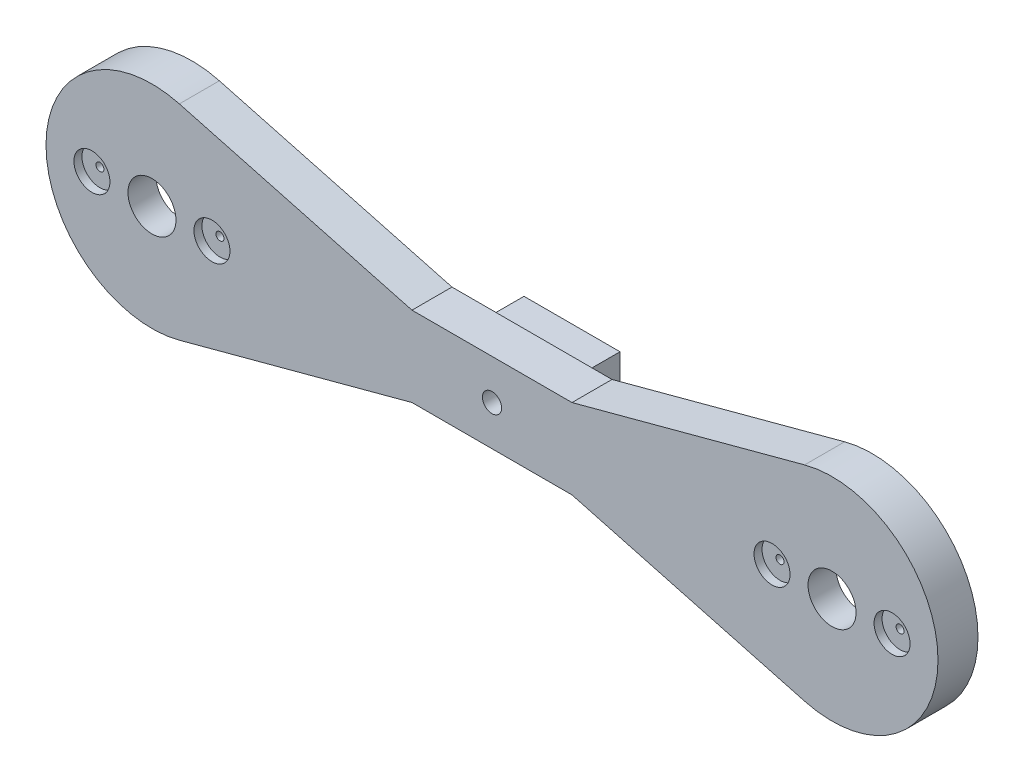
ISO-10303-21;
HEADER;
FILE_DESCRIPTION(('STEP AP214'),'2;1');
FILE_NAME('part.step','',(''),(''),'','','');
FILE_SCHEMA(('AUTOMOTIVE_DESIGN { 1 0 10303 214 1 1 1 1 }'));
ENDSEC;
DATA;
#1=APPLICATION_CONTEXT('core data for automotive mechanical design processes');
#2=APPLICATION_PROTOCOL_DEFINITION('international standard','automotive_design',2000,#1);
#3=PRODUCT_CONTEXT('',#1,'mechanical');
#4=PRODUCT('Part','Part','',(#3));
#5=PRODUCT_RELATED_PRODUCT_CATEGORY('part','',(#4));
#6=PRODUCT_DEFINITION_FORMATION('','',#4);
#7=PRODUCT_DEFINITION_CONTEXT('part definition',#1,'design');
#8=PRODUCT_DEFINITION('design','',#6,#7);
#9=PRODUCT_DEFINITION_SHAPE('','',#8);
#10=(LENGTH_UNIT() NAMED_UNIT(*) SI_UNIT(.MILLI.,.METRE.));
#11=(NAMED_UNIT(*) PLANE_ANGLE_UNIT() SI_UNIT($,.RADIAN.));
#12=(NAMED_UNIT(*) SI_UNIT($,.STERADIAN.) SOLID_ANGLE_UNIT());
#13=UNCERTAINTY_MEASURE_WITH_UNIT(LENGTH_MEASURE(1.E-05),#10,'distance_accuracy_value','');
#14=(GEOMETRIC_REPRESENTATION_CONTEXT(3) GLOBAL_UNCERTAINTY_ASSIGNED_CONTEXT((#13)) GLOBAL_UNIT_ASSIGNED_CONTEXT((#10,
#11,#12)) REPRESENTATION_CONTEXT('',''));
#15=CARTESIAN_POINT('',(0.,0.,0.));
#16=DIRECTION('',(0.,0.,1.));
#17=DIRECTION('',(1.,0.,0.));
#18=AXIS2_PLACEMENT_3D('',#15,#16,#17);
#19=CARTESIAN_POINT('',(-49.9999999999997,0.,6.5));
#20=DIRECTION('',(0.,0.,-1.));
#21=DIRECTION('',(-1.,0.,0.));
#22=AXIS2_PLACEMENT_3D('',#19,#20,#21);
#23=CYLINDRICAL_SURFACE('',#22,0.499999999999999);
#24=CARTESIAN_POINT('',(-49.9999999999997,0.,1.5));
#25=DIRECTION('',(0.,0.,-1.));
#26=DIRECTION('',(1.,0.,0.));
#27=AXIS2_PLACEMENT_3D('',#24,#25,#26);
#28=CIRCLE('',#27,0.499999999999999);
#29=CARTESIAN_POINT('',(-49.4999999999997,0.,1.5));
#30=VERTEX_POINT('',#29);
#31=EDGE_CURVE('E385',#30,#30,#28,.T.);
#32=ORIENTED_EDGE('',*,*,#31,.T.);
#33=EDGE_LOOP('',(#32));
#34=FACE_BOUND('',#33,.T.);
#35=CARTESIAN_POINT('',(-49.9999999999997,0.,4.));
#36=DIRECTION('',(0.,0.,1.));
#37=DIRECTION('',(1.,0.,0.));
#38=AXIS2_PLACEMENT_3D('',#35,#36,#37);
#39=CIRCLE('',#38,0.499999999999999);
#40=CARTESIAN_POINT('',(-49.4999999999997,0.,4.));
#41=VERTEX_POINT('',#40);
#42=EDGE_CURVE('E67',#41,#41,#39,.F.);
#43=ORIENTED_EDGE('',*,*,#42,.F.);
#44=EDGE_LOOP('',(#43));
#45=FACE_BOUND('',#44,.T.);
#46=ADVANCED_FACE('F63',(#34,#45),#23,.F.);
#47=CARTESIAN_POINT('',(-34.9999999999997,0.,6.5));
#48=DIRECTION('',(0.,0.,-1.));
#49=DIRECTION('',(-1.,0.,0.));
#50=AXIS2_PLACEMENT_3D('',#47,#48,#49);
#51=CYLINDRICAL_SURFACE('',#50,0.499999999999999);
#52=CARTESIAN_POINT('',(-34.9999999999997,0.,1.5));
#53=DIRECTION('',(0.,0.,-1.));
#54=DIRECTION('',(1.,0.,0.));
#55=AXIS2_PLACEMENT_3D('',#52,#53,#54);
#56=CIRCLE('',#55,0.499999999999999);
#57=CARTESIAN_POINT('',(-34.4999999999997,0.,1.5));
#58=VERTEX_POINT('',#57);
#59=EDGE_CURVE('E390',#58,#58,#56,.T.);
#60=ORIENTED_EDGE('',*,*,#59,.T.);
#61=EDGE_LOOP('',(#60));
#62=FACE_BOUND('',#61,.T.);
#63=CARTESIAN_POINT('',(-34.9999999999997,0.,4.));
#64=DIRECTION('',(0.,0.,1.));
#65=DIRECTION('',(1.,0.,0.));
#66=AXIS2_PLACEMENT_3D('',#63,#64,#65);
#67=CIRCLE('',#66,0.499999999999999);
#68=CARTESIAN_POINT('',(-34.4999999999997,0.,4.));
#69=VERTEX_POINT('',#68);
#70=EDGE_CURVE('E378',#69,#69,#67,.F.);
#71=ORIENTED_EDGE('',*,*,#70,.F.);
#72=EDGE_LOOP('',(#71));
#73=FACE_BOUND('',#72,.T.);
#74=ADVANCED_FACE('F444',(#62,#73),#51,.F.);
#75=CARTESIAN_POINT('',(34.9999999999997,0.,6.5));
#76=DIRECTION('',(0.,0.,-1.));
#77=DIRECTION('',(-1.,0.,0.));
#78=AXIS2_PLACEMENT_3D('',#75,#76,#77);
#79=CYLINDRICAL_SURFACE('',#78,0.499999999999999);
#80=CARTESIAN_POINT('',(34.9999999999997,0.,1.5));
#81=DIRECTION('',(0.,0.,-1.));
#82=DIRECTION('',(-1.,0.,0.));
#83=AXIS2_PLACEMENT_3D('',#80,#81,#82);
#84=CIRCLE('',#83,0.499999999999999);
#85=CARTESIAN_POINT('',(34.4999999999997,0.,1.5));
#86=VERTEX_POINT('',#85);
#87=EDGE_CURVE('E396',#86,#86,#84,.T.);
#88=ORIENTED_EDGE('',*,*,#87,.T.);
#89=EDGE_LOOP('',(#88));
#90=FACE_BOUND('',#89,.T.);
#91=CARTESIAN_POINT('',(34.9999999999997,0.,4.));
#92=DIRECTION('',(0.,0.,1.));
#93=DIRECTION('',(1.,0.,0.));
#94=AXIS2_PLACEMENT_3D('',#91,#92,#93);
#95=CIRCLE('',#94,0.499999999999999);
#96=CARTESIAN_POINT('',(35.4999999999997,0.,4.));
#97=VERTEX_POINT('',#96);
#98=EDGE_CURVE('E374',#97,#97,#95,.F.);
#99=ORIENTED_EDGE('',*,*,#98,.F.);
#100=EDGE_LOOP('',(#99));
#101=FACE_BOUND('',#100,.T.);
#102=ADVANCED_FACE('F449',(#90,#101),#79,.F.);
#103=CARTESIAN_POINT('',(49.9999999999997,0.,6.5));
#104=DIRECTION('',(0.,0.,-1.));
#105=DIRECTION('',(-1.,0.,0.));
#106=AXIS2_PLACEMENT_3D('',#103,#104,#105);
#107=CYLINDRICAL_SURFACE('',#106,0.499999999999999);
#108=CARTESIAN_POINT('',(49.9999999999997,0.,1.5));
#109=DIRECTION('',(0.,0.,-1.));
#110=DIRECTION('',(-1.,0.,0.));
#111=AXIS2_PLACEMENT_3D('',#108,#109,#110);
#112=CIRCLE('',#111,0.499999999999999);
#113=CARTESIAN_POINT('',(49.4999999999997,0.,1.5));
#114=VERTEX_POINT('',#113);
#115=EDGE_CURVE('E414',#114,#114,#112,.T.);
#116=ORIENTED_EDGE('',*,*,#115,.T.);
#117=EDGE_LOOP('',(#116));
#118=FACE_BOUND('',#117,.T.);
#119=CARTESIAN_POINT('',(49.9999999999997,0.,4.));
#120=DIRECTION('',(0.,0.,1.));
#121=DIRECTION('',(1.,0.,0.));
#122=AXIS2_PLACEMENT_3D('',#119,#120,#121);
#123=CIRCLE('',#122,0.499999999999999);
#124=CARTESIAN_POINT('',(50.4999999999997,0.,4.));
#125=VERTEX_POINT('',#124);
#126=EDGE_CURVE('E370',#125,#125,#123,.F.);
#127=ORIENTED_EDGE('',*,*,#126,.F.);
#128=EDGE_LOOP('',(#127));
#129=FACE_BOUND('',#128,.T.);
#130=ADVANCED_FACE('F532',(#118,#129),#107,.F.);
#131=CARTESIAN_POINT('',(-42.5000000000004,0.,5.));
#132=DIRECTION('',(0.,0.,-1.));
#133=DIRECTION('',(-1.,0.,0.));
#134=AXIS2_PLACEMENT_3D('',#131,#132,#133);
#135=CYLINDRICAL_SURFACE('',#134,3.);
#136=CARTESIAN_POINT('',(-42.5000000000004,0.,5.));
#137=DIRECTION('',(0.,0.,1.));
#138=DIRECTION('',(1.,0.,0.));
#139=AXIS2_PLACEMENT_3D('',#136,#137,#138);
#140=CIRCLE('',#139,3.);
#141=CARTESIAN_POINT('',(-39.5000000000004,0.,5.));
#142=VERTEX_POINT('',#141);
#143=EDGE_CURVE('E280',#142,#142,#140,.T.);
#144=ORIENTED_EDGE('',*,*,#143,.T.);
#145=EDGE_LOOP('',(#144));
#146=FACE_BOUND('',#145,.T.);
#147=CARTESIAN_POINT('',(-42.5000000000004,0.,1.5));
#148=DIRECTION('',(0.,0.,-1.));
#149=DIRECTION('',(-1.,0.,0.));
#150=AXIS2_PLACEMENT_3D('',#147,#148,#149);
#151=CIRCLE('',#150,3.);
#152=CARTESIAN_POINT('',(-45.5000000000004,0.,1.5));
#153=VERTEX_POINT('',#152);
#154=EDGE_CURVE('E365',#153,#153,#151,.T.);
#155=ORIENTED_EDGE('',*,*,#154,.T.);
#156=EDGE_LOOP('',(#155));
#157=FACE_BOUND('',#156,.T.);
#158=ADVANCED_FACE('F521',(#146,#157),#135,.F.);
#159=CARTESIAN_POINT('',(42.4999999999997,0.,5.));
#160=DIRECTION('',(0.,0.,-1.));
#161=DIRECTION('',(-1.,0.,0.));
#162=AXIS2_PLACEMENT_3D('',#159,#160,#161);
#163=CYLINDRICAL_SURFACE('',#162,3.);
#164=CARTESIAN_POINT('',(42.4999999999997,0.,5.));
#165=DIRECTION('',(0.,0.,1.));
#166=DIRECTION('',(1.,0.,0.));
#167=AXIS2_PLACEMENT_3D('',#164,#165,#166);
#168=CIRCLE('',#167,3.);
#169=CARTESIAN_POINT('',(45.4999999999997,0.,5.));
#170=VERTEX_POINT('',#169);
#171=EDGE_CURVE('E266',#170,#170,#168,.T.);
#172=ORIENTED_EDGE('',*,*,#171,.T.);
#173=EDGE_LOOP('',(#172));
#174=FACE_BOUND('',#173,.T.);
#175=CARTESIAN_POINT('',(42.4999999999997,0.,1.5));
#176=DIRECTION('',(0.,0.,-1.));
#177=DIRECTION('',(-1.,0.,0.));
#178=AXIS2_PLACEMENT_3D('',#175,#176,#177);
#179=CIRCLE('',#178,3.);
#180=CARTESIAN_POINT('',(39.4999999999996,0.,1.5));
#181=VERTEX_POINT('',#180);
#182=EDGE_CURVE('E361',#181,#181,#179,.T.);
#183=ORIENTED_EDGE('',*,*,#182,.T.);
#184=EDGE_LOOP('',(#183));
#185=FACE_BOUND('',#184,.T.);
#186=ADVANCED_FACE('F514',(#174,#185),#163,.F.);
#187=CARTESIAN_POINT('',(-42.5000000000004,0.,5.));
#188=DIRECTION('',(0.,0.,1.));
#189=DIRECTION('',(1.,0.,0.));
#190=AXIS2_PLACEMENT_3D('',#187,#188,#189);
#191=PLANE('',#190);
#192=CARTESIAN_POINT('',(-49.9999999999997,0.,5.));
#193=DIRECTION('',(0.,0.,1.));
#194=DIRECTION('',(1.,0.,0.));
#195=AXIS2_PLACEMENT_3D('',#192,#193,#194);
#196=CIRCLE('',#195,2.25);
#197=CARTESIAN_POINT('',(-47.7499999999996,0.,5.));
#198=VERTEX_POINT('',#197);
#199=EDGE_CURVE('E696',#198,#198,#196,.T.);
#200=ORIENTED_EDGE('',*,*,#199,.F.);
#201=EDGE_LOOP('',(#200));
#202=FACE_BOUND('',#201,.T.);
#203=CARTESIAN_POINT('',(-34.9999999999997,0.,5.));
#204=DIRECTION('',(0.,0.,1.));
#205=DIRECTION('',(1.,0.,0.));
#206=AXIS2_PLACEMENT_3D('',#203,#204,#205);
#207=CIRCLE('',#206,2.25);
#208=CARTESIAN_POINT('',(-32.7499999999996,0.,5.));
#209=VERTEX_POINT('',#208);
#210=EDGE_CURVE('E688',#209,#209,#207,.T.);
#211=ORIENTED_EDGE('',*,*,#210,.F.);
#212=EDGE_LOOP('',(#211));
#213=FACE_BOUND('',#212,.T.);
#214=CARTESIAN_POINT('',(34.9999999999997,0.,5.));
#215=DIRECTION('',(0.,0.,1.));
#216=DIRECTION('',(1.,0.,0.));
#217=AXIS2_PLACEMENT_3D('',#214,#215,#216);
#218=CIRCLE('',#217,2.25);
#219=CARTESIAN_POINT('',(37.2499999999997,0.,5.));
#220=VERTEX_POINT('',#219);
#221=EDGE_CURVE('E680',#220,#220,#218,.T.);
#222=ORIENTED_EDGE('',*,*,#221,.F.);
#223=EDGE_LOOP('',(#222));
#224=FACE_BOUND('',#223,.T.);
#225=CARTESIAN_POINT('',(49.9999999999997,0.,5.));
#226=DIRECTION('',(0.,0.,1.));
#227=DIRECTION('',(1.,0.,0.));
#228=AXIS2_PLACEMENT_3D('',#225,#226,#227);
#229=CIRCLE('',#228,2.25);
#230=CARTESIAN_POINT('',(52.2499999999997,0.,5.));
#231=VERTEX_POINT('',#230);
#232=EDGE_CURVE('E672',#231,#231,#229,.T.);
#233=ORIENTED_EDGE('',*,*,#232,.F.);
#234=EDGE_LOOP('',(#233));
#235=FACE_BOUND('',#234,.T.);
#236=CARTESIAN_POINT('',(0.,0.,5.));
#237=DIRECTION('',(0.,0.,1.));
#238=DIRECTION('',(1.,0.,0.));
#239=AXIS2_PLACEMENT_3D('',#236,#237,#238);
#240=CIRCLE('',#239,1.2);
#241=CARTESIAN_POINT('',(1.2,0.,5.));
#242=VERTEX_POINT('',#241);
#243=EDGE_CURVE('E213',#242,#242,#240,.F.);
#244=ORIENTED_EDGE('',*,*,#243,.T.);
#245=EDGE_LOOP('',(#244));
#246=FACE_BOUND('',#245,.T.);
#247=ORIENTED_EDGE('',*,*,#143,.F.);
#248=EDGE_LOOP('',(#247));
#249=FACE_BOUND('',#248,.T.);
#250=DIRECTION('',(-0.96592582628907,0.258819045102515,0.));
#251=VECTOR('',#250,1.);
#252=CARTESIAN_POINT('',(-10.,5.,5.));
#253=LINE('',#252,#251);
#254=CARTESIAN_POINT('',(-10.,5.,5.));
#255=VERTEX_POINT('',#254);
#256=CARTESIAN_POINT('',(-39.0729128114976,12.790063509461,5.));
#257=VERTEX_POINT('',#256);
#258=EDGE_CURVE('E285',#255,#257,#253,.T.);
#259=ORIENTED_EDGE('',*,*,#258,.T.);
#260=CARTESIAN_POINT('',(-42.5000000000004,0.,5.));
#261=DIRECTION('',(0.,0.,1.));
#262=DIRECTION('',(1.,0.,0.));
#263=AXIS2_PLACEMENT_3D('',#260,#261,#262);
#264=CIRCLE('',#263,13.2412480972772);
#265=CARTESIAN_POINT('',(-39.0729128114976,-12.790063509461,5.));
#266=VERTEX_POINT('',#265);
#267=EDGE_CURVE('E289',#257,#266,#264,.T.);
#268=ORIENTED_EDGE('',*,*,#267,.T.);
#269=DIRECTION('',(0.96592582628907,0.258819045102515,0.));
#270=VECTOR('',#269,1.);
#271=CARTESIAN_POINT('',(-10.,-5.,5.));
#272=LINE('',#271,#270);
#273=CARTESIAN_POINT('',(-10.,-5.,5.));
#274=VERTEX_POINT('',#273);
#275=EDGE_CURVE('E293',#266,#274,#272,.T.);
#276=ORIENTED_EDGE('',*,*,#275,.T.);
#277=DIRECTION('',(1.,0.,0.));
#278=VECTOR('',#277,1.);
#279=CARTESIAN_POINT('',(-10.,-5.,5.));
#280=LINE('',#279,#278);
#281=CARTESIAN_POINT('',(10.,-5.,5.));
#282=VERTEX_POINT('',#281);
#283=EDGE_CURVE('E296',#274,#282,#280,.T.);
#284=ORIENTED_EDGE('',*,*,#283,.T.);
#285=DIRECTION('',(0.965925826289068,-0.258819045102521,0.));
#286=VECTOR('',#285,1.);
#287=CARTESIAN_POINT('',(10.,-5.,5.));
#288=LINE('',#287,#286);
#289=CARTESIAN_POINT('',(39.0729128114968,-12.790063509461,5.));
#290=VERTEX_POINT('',#289);
#291=EDGE_CURVE('E299',#282,#290,#288,.T.);
#292=ORIENTED_EDGE('',*,*,#291,.T.);
#293=CARTESIAN_POINT('',(42.4999999999997,0.,5.));
#294=DIRECTION('',(0.,0.,1.));
#295=DIRECTION('',(-1.,0.,0.));
#296=AXIS2_PLACEMENT_3D('',#293,#294,#295);
#297=CIRCLE('',#296,13.2412480972772);
#298=CARTESIAN_POINT('',(39.0729128114968,12.790063509461,5.));
#299=VERTEX_POINT('',#298);
#300=EDGE_CURVE('E302',#290,#299,#297,.T.);
#301=ORIENTED_EDGE('',*,*,#300,.T.);
#302=DIRECTION('',(-0.965925826289068,-0.258819045102521,0.));
#303=VECTOR('',#302,1.);
#304=CARTESIAN_POINT('',(10.,5.,5.));
#305=LINE('',#304,#303);
#306=CARTESIAN_POINT('',(10.,5.,5.));
#307=VERTEX_POINT('',#306);
#308=EDGE_CURVE('E305',#299,#307,#305,.T.);
#309=ORIENTED_EDGE('',*,*,#308,.T.);
#310=DIRECTION('',(-1.,0.,0.));
#311=VECTOR('',#310,1.);
#312=CARTESIAN_POINT('',(-10.,5.,5.));
#313=LINE('',#312,#311);
#314=EDGE_CURVE('E308',#307,#255,#313,.T.);
#315=ORIENTED_EDGE('',*,*,#314,.T.);
#316=EDGE_LOOP('',(#259,#268,#276,#284,#292,#301,#309,#315));
#317=FACE_BOUND('',#316,.T.);
#318=ORIENTED_EDGE('',*,*,#171,.F.);
#319=EDGE_LOOP('',(#318));
#320=FACE_BOUND('',#319,.T.);
#321=ADVANCED_FACE('F423',(#202,#213,#224,#235,#246,#249,#317,#320),#191,.T.);
#322=CARTESIAN_POINT('',(-42.5000000000004,0.,0.));
#323=DIRECTION('',(0.,0.,1.));
#324=DIRECTION('',(1.,0.,0.));
#325=AXIS2_PLACEMENT_3D('',#322,#323,#324);
#326=PLANE('',#325);
#327=CARTESIAN_POINT('',(42.4999999999997,0.,0.));
#328=DIRECTION('',(0.,0.,-1.));
#329=DIRECTION('',(-1.,0.,0.));
#330=AXIS2_PLACEMENT_3D('',#327,#328,#329);
#331=CIRCLE('',#330,9.);
#332=CARTESIAN_POINT('',(33.4999999999996,0.,0.));
#333=VERTEX_POINT('',#332);
#334=EDGE_CURVE('E403',#333,#333,#331,.T.);
#335=ORIENTED_EDGE('',*,*,#334,.F.);
#336=EDGE_LOOP('',(#335));
#337=FACE_BOUND('',#336,.T.);
#338=CARTESIAN_POINT('',(-42.5000000000004,0.,0.));
#339=DIRECTION('',(0.,0.,-1.));
#340=DIRECTION('',(-1.,0.,0.));
#341=AXIS2_PLACEMENT_3D('',#338,#339,#340);
#342=CIRCLE('',#341,9.);
#343=CARTESIAN_POINT('',(-51.5000000000004,0.,0.));
#344=VERTEX_POINT('',#343);
#345=EDGE_CURVE('E411',#344,#344,#342,.T.);
#346=ORIENTED_EDGE('',*,*,#345,.F.);
#347=EDGE_LOOP('',(#346));
#348=FACE_BOUND('',#347,.T.);
#349=DIRECTION('',(-1.,0.,0.));
#350=VECTOR('',#349,1.);
#351=CARTESIAN_POINT('',(0.,3.5,0.));
#352=LINE('',#351,#350);
#353=CARTESIAN_POINT('',(6.,3.5,0.));
#354=VERTEX_POINT('',#353);
#355=CARTESIAN_POINT('',(-6.,3.5,0.));
#356=VERTEX_POINT('',#355);
#357=EDGE_CURVE('E81',#354,#356,#352,.T.);
#358=ORIENTED_EDGE('',*,*,#357,.T.);
#359=DIRECTION('',(0.,-1.,0.));
#360=VECTOR('',#359,1.);
#361=CARTESIAN_POINT('',(-6.,0.,0.));
#362=LINE('',#361,#360);
#363=CARTESIAN_POINT('',(-6.,-3.5,0.));
#364=VERTEX_POINT('',#363);
#365=EDGE_CURVE('E232',#356,#364,#362,.T.);
#366=ORIENTED_EDGE('',*,*,#365,.T.);
#367=DIRECTION('',(-1.,0.,0.));
#368=VECTOR('',#367,1.);
#369=CARTESIAN_POINT('',(0.,-3.5,0.));
#370=LINE('',#369,#368);
#371=CARTESIAN_POINT('',(6.,-3.5,0.));
#372=VERTEX_POINT('',#371);
#373=EDGE_CURVE('E255',#372,#364,#370,.T.);
#374=ORIENTED_EDGE('',*,*,#373,.F.);
#375=DIRECTION('',(0.,-1.,0.));
#376=VECTOR('',#375,1.);
#377=CARTESIAN_POINT('',(6.,0.,0.));
#378=LINE('',#377,#376);
#379=EDGE_CURVE('E86',#354,#372,#378,.T.);
#380=ORIENTED_EDGE('',*,*,#379,.F.);
#381=EDGE_LOOP('',(#358,#366,#374,#380));
#382=FACE_BOUND('',#381,.T.);
#383=DIRECTION('',(-0.96592582628907,0.258819045102515,0.));
#384=VECTOR('',#383,1.);
#385=CARTESIAN_POINT('',(-10.,5.,0.));
#386=LINE('',#385,#384);
#387=CARTESIAN_POINT('',(-10.,5.,0.));
#388=VERTEX_POINT('',#387);
#389=CARTESIAN_POINT('',(-39.0729128114976,12.790063509461,0.));
#390=VERTEX_POINT('',#389);
#391=EDGE_CURVE('E284',#388,#390,#386,.T.);
#392=ORIENTED_EDGE('',*,*,#391,.F.);
#393=DIRECTION('',(-1.,0.,0.));
#394=VECTOR('',#393,1.);
#395=CARTESIAN_POINT('',(-10.,5.,0.));
#396=LINE('',#395,#394);
#397=CARTESIAN_POINT('',(10.,5.,0.));
#398=VERTEX_POINT('',#397);
#399=EDGE_CURVE('E290',#398,#388,#396,.T.);
#400=ORIENTED_EDGE('',*,*,#399,.F.);
#401=DIRECTION('',(-0.965925826289068,-0.258819045102521,0.));
#402=VECTOR('',#401,1.);
#403=CARTESIAN_POINT('',(10.,5.,0.));
#404=LINE('',#403,#402);
#405=CARTESIAN_POINT('',(39.0729128114968,12.790063509461,0.));
#406=VERTEX_POINT('',#405);
#407=EDGE_CURVE('E330',#406,#398,#404,.T.);
#408=ORIENTED_EDGE('',*,*,#407,.F.);
#409=CARTESIAN_POINT('',(42.4999999999997,0.,0.));
#410=DIRECTION('',(0.,0.,1.));
#411=DIRECTION('',(-1.,0.,0.));
#412=AXIS2_PLACEMENT_3D('',#409,#410,#411);
#413=CIRCLE('',#412,13.2412480972772);
#414=CARTESIAN_POINT('',(39.0729128114968,-12.790063509461,0.));
#415=VERTEX_POINT('',#414);
#416=EDGE_CURVE('E327',#415,#406,#413,.T.);
#417=ORIENTED_EDGE('',*,*,#416,.F.);
#418=DIRECTION('',(0.965925826289068,-0.258819045102521,0.));
#419=VECTOR('',#418,1.);
#420=CARTESIAN_POINT('',(10.,-5.,0.));
#421=LINE('',#420,#419);
#422=CARTESIAN_POINT('',(10.,-5.,0.));
#423=VERTEX_POINT('',#422);
#424=EDGE_CURVE('E324',#423,#415,#421,.T.);
#425=ORIENTED_EDGE('',*,*,#424,.F.);
#426=DIRECTION('',(1.,0.,0.));
#427=VECTOR('',#426,1.);
#428=CARTESIAN_POINT('',(-10.,-5.,0.));
#429=LINE('',#428,#427);
#430=CARTESIAN_POINT('',(-10.,-5.,0.));
#431=VERTEX_POINT('',#430);
#432=EDGE_CURVE('E321',#431,#423,#429,.T.);
#433=ORIENTED_EDGE('',*,*,#432,.F.);
#434=DIRECTION('',(0.96592582628907,0.258819045102515,0.));
#435=VECTOR('',#434,1.);
#436=CARTESIAN_POINT('',(-10.,-5.,0.));
#437=LINE('',#436,#435);
#438=CARTESIAN_POINT('',(-39.0729128114976,-12.790063509461,0.));
#439=VERTEX_POINT('',#438);
#440=EDGE_CURVE('E318',#439,#431,#437,.T.);
#441=ORIENTED_EDGE('',*,*,#440,.F.);
#442=CARTESIAN_POINT('',(-42.5000000000004,0.,0.));
#443=DIRECTION('',(0.,0.,1.));
#444=DIRECTION('',(1.,0.,0.));
#445=AXIS2_PLACEMENT_3D('',#442,#443,#444);
#446=CIRCLE('',#445,13.2412480972772);
#447=EDGE_CURVE('E315',#390,#439,#446,.T.);
#448=ORIENTED_EDGE('',*,*,#447,.F.);
#449=EDGE_LOOP('',(#392,#400,#408,#417,#425,#433,#441,#448));
#450=FACE_BOUND('',#449,.T.);
#451=ADVANCED_FACE('F440',(#337,#348,#382,#450),#326,.F.);
#452=CARTESIAN_POINT('',(-10.,5.,5.));
#453=DIRECTION('',(-0.258819045102515,-0.96592582628907,0.));
#454=DIRECTION('',(0.96592582628907,-0.258819045102515,0.));
#455=AXIS2_PLACEMENT_3D('',#452,#453,#454);
#456=PLANE('',#455);
#457=ORIENTED_EDGE('',*,*,#391,.T.);
#458=DIRECTION('',(0.,0.,-1.));
#459=VECTOR('',#458,1.);
#460=CARTESIAN_POINT('',(-39.0729128114976,12.790063509461,5.));
#461=LINE('',#460,#459);
#462=EDGE_CURVE('E12',#257,#390,#461,.T.);
#463=ORIENTED_EDGE('',*,*,#462,.F.);
#464=ORIENTED_EDGE('',*,*,#258,.F.);
#465=DIRECTION('',(0.,0.,-1.));
#466=VECTOR('',#465,1.);
#467=CARTESIAN_POINT('',(-10.,5.,5.));
#468=LINE('',#467,#466);
#469=EDGE_CURVE('E311',#255,#388,#468,.T.);
#470=ORIENTED_EDGE('',*,*,#469,.T.);
#471=EDGE_LOOP('',(#457,#463,#464,#470));
#472=FACE_BOUND('',#471,.T.);
#473=ADVANCED_FACE('F65',(#472),#456,.F.);
#474=CARTESIAN_POINT('',(-42.5000000000004,0.,5.));
#475=DIRECTION('',(0.,0.,-1.));
#476=DIRECTION('',(-1.,0.,0.));
#477=AXIS2_PLACEMENT_3D('',#474,#475,#476);
#478=CYLINDRICAL_SURFACE('',#477,13.2412480972772);
#479=ORIENTED_EDGE('',*,*,#447,.T.);
#480=DIRECTION('',(0.,0.,-1.));
#481=VECTOR('',#480,1.);
#482=CARTESIAN_POINT('',(-39.0729128114976,-12.790063509461,5.));
#483=LINE('',#482,#481);
#484=EDGE_CURVE('E73',#266,#439,#483,.T.);
#485=ORIENTED_EDGE('',*,*,#484,.F.);
#486=ORIENTED_EDGE('',*,*,#267,.F.);
#487=ORIENTED_EDGE('',*,*,#462,.T.);
#488=EDGE_LOOP('',(#479,#485,#486,#487));
#489=FACE_BOUND('',#488,.T.);
#490=ADVANCED_FACE('F510',(#489),#478,.T.);
#491=CARTESIAN_POINT('',(-10.,-5.,5.));
#492=DIRECTION('',(-0.258819045102515,0.96592582628907,0.));
#493=DIRECTION('',(-0.96592582628907,-0.258819045102515,0.));
#494=AXIS2_PLACEMENT_3D('',#491,#492,#493);
#495=PLANE('',#494);
#496=ORIENTED_EDGE('',*,*,#440,.T.);
#497=DIRECTION('',(0.,0.,-1.));
#498=VECTOR('',#497,1.);
#499=CARTESIAN_POINT('',(-10.,-5.,5.));
#500=LINE('',#499,#498);
#501=EDGE_CURVE('E354',#274,#431,#500,.T.);
#502=ORIENTED_EDGE('',*,*,#501,.F.);
#503=ORIENTED_EDGE('',*,*,#275,.F.);
#504=ORIENTED_EDGE('',*,*,#484,.T.);
#505=EDGE_LOOP('',(#496,#502,#503,#504));
#506=FACE_BOUND('',#505,.T.);
#507=ADVANCED_FACE('F506',(#506),#495,.F.);
#508=CARTESIAN_POINT('',(-10.,-5.,5.));
#509=DIRECTION('',(0.,1.,0.));
#510=DIRECTION('',(0.,0.,1.));
#511=AXIS2_PLACEMENT_3D('',#508,#509,#510);
#512=PLANE('',#511);
#513=ORIENTED_EDGE('',*,*,#432,.T.);
#514=DIRECTION('',(0.,0.,-1.));
#515=VECTOR('',#514,1.);
#516=CARTESIAN_POINT('',(10.,-5.,5.));
#517=LINE('',#516,#515);
#518=EDGE_CURVE('E350',#282,#423,#517,.T.);
#519=ORIENTED_EDGE('',*,*,#518,.F.);
#520=ORIENTED_EDGE('',*,*,#283,.F.);
#521=ORIENTED_EDGE('',*,*,#501,.T.);
#522=EDGE_LOOP('',(#513,#519,#520,#521));
#523=FACE_BOUND('',#522,.T.);
#524=ADVANCED_FACE('F503',(#523),#512,.F.);
#525=CARTESIAN_POINT('',(10.,-5.,5.));
#526=DIRECTION('',(0.258819045102521,0.965925826289068,0.));
#527=DIRECTION('',(-0.965925826289068,0.258819045102521,0.));
#528=AXIS2_PLACEMENT_3D('',#525,#526,#527);
#529=PLANE('',#528);
#530=ORIENTED_EDGE('',*,*,#424,.T.);
#531=DIRECTION('',(0.,0.,-1.));
#532=VECTOR('',#531,1.);
#533=CARTESIAN_POINT('',(39.0729128114968,-12.790063509461,5.));
#534=LINE('',#533,#532);
#535=EDGE_CURVE('E346',#290,#415,#534,.T.);
#536=ORIENTED_EDGE('',*,*,#535,.F.);
#537=ORIENTED_EDGE('',*,*,#291,.F.);
#538=ORIENTED_EDGE('',*,*,#518,.T.);
#539=EDGE_LOOP('',(#530,#536,#537,#538));
#540=FACE_BOUND('',#539,.T.);
#541=ADVANCED_FACE('F499',(#540),#529,.F.);
#542=CARTESIAN_POINT('',(42.4999999999997,0.,5.));
#543=DIRECTION('',(0.,0.,-1.));
#544=DIRECTION('',(-1.,0.,0.));
#545=AXIS2_PLACEMENT_3D('',#542,#543,#544);
#546=CYLINDRICAL_SURFACE('',#545,13.2412480972772);
#547=ORIENTED_EDGE('',*,*,#416,.T.);
#548=DIRECTION('',(0.,0.,-1.));
#549=VECTOR('',#548,1.);
#550=CARTESIAN_POINT('',(39.0729128114968,12.790063509461,5.));
#551=LINE('',#550,#549);
#552=EDGE_CURVE('E342',#299,#406,#551,.T.);
#553=ORIENTED_EDGE('',*,*,#552,.F.);
#554=ORIENTED_EDGE('',*,*,#300,.F.);
#555=ORIENTED_EDGE('',*,*,#535,.T.);
#556=EDGE_LOOP('',(#547,#553,#554,#555));
#557=FACE_BOUND('',#556,.T.);
#558=ADVANCED_FACE('F494',(#557),#546,.T.);
#559=CARTESIAN_POINT('',(10.,5.,5.));
#560=DIRECTION('',(0.258819045102521,-0.965925826289068,0.));
#561=DIRECTION('',(0.965925826289068,0.258819045102521,0.));
#562=AXIS2_PLACEMENT_3D('',#559,#560,#561);
#563=PLANE('',#562);
#564=ORIENTED_EDGE('',*,*,#407,.T.);
#565=DIRECTION('',(0.,0.,-1.));
#566=VECTOR('',#565,1.);
#567=CARTESIAN_POINT('',(10.,5.,5.));
#568=LINE('',#567,#566);
#569=EDGE_CURVE('E338',#307,#398,#568,.T.);
#570=ORIENTED_EDGE('',*,*,#569,.F.);
#571=ORIENTED_EDGE('',*,*,#308,.F.);
#572=ORIENTED_EDGE('',*,*,#552,.T.);
#573=EDGE_LOOP('',(#564,#570,#571,#572));
#574=FACE_BOUND('',#573,.T.);
#575=ADVANCED_FACE('F488',(#574),#563,.F.);
#576=CARTESIAN_POINT('',(-10.,5.,5.));
#577=DIRECTION('',(0.,-1.,0.));
#578=DIRECTION('',(0.,0.,-1.));
#579=AXIS2_PLACEMENT_3D('',#576,#577,#578);
#580=PLANE('',#579);
#581=ORIENTED_EDGE('',*,*,#399,.T.);
#582=ORIENTED_EDGE('',*,*,#469,.F.);
#583=ORIENTED_EDGE('',*,*,#314,.F.);
#584=ORIENTED_EDGE('',*,*,#569,.T.);
#585=EDGE_LOOP('',(#581,#582,#583,#584));
#586=FACE_BOUND('',#585,.T.);
#587=ADVANCED_FACE('F484',(#586),#580,.F.);
#588=CARTESIAN_POINT('',(-6.,0.,-5.));
#589=DIRECTION('',(-1.,0.,0.));
#590=DIRECTION('',(0.,-1.,0.));
#591=AXIS2_PLACEMENT_3D('',#588,#589,#590);
#592=PLANE('',#591);
#593=ORIENTED_EDGE('',*,*,#365,.F.);
#594=DIRECTION('',(0.,0.,1.));
#595=VECTOR('',#594,1.);
#596=CARTESIAN_POINT('',(-6.,3.5,-5.));
#597=LINE('',#596,#595);
#598=CARTESIAN_POINT('',(-6.,3.5,-5.));
#599=VERTEX_POINT('',#598);
#600=EDGE_CURVE('E263',#599,#356,#597,.T.);
#601=ORIENTED_EDGE('',*,*,#600,.F.);
#602=DIRECTION('',(0.,-1.,0.));
#603=VECTOR('',#602,1.);
#604=CARTESIAN_POINT('',(-6.,0.,-5.));
#605=LINE('',#604,#603);
#606=CARTESIAN_POINT('',(-6.,-3.5,-5.));
#607=VERTEX_POINT('',#606);
#608=EDGE_CURVE('E238',#599,#607,#605,.T.);
#609=ORIENTED_EDGE('',*,*,#608,.T.);
#610=DIRECTION('',(0.,0.,1.));
#611=VECTOR('',#610,1.);
#612=CARTESIAN_POINT('',(-6.,-3.5,-5.));
#613=LINE('',#612,#611);
#614=EDGE_CURVE('E252',#607,#364,#613,.T.);
#615=ORIENTED_EDGE('',*,*,#614,.T.);
#616=EDGE_LOOP('',(#593,#601,#609,#615));
#617=FACE_BOUND('',#616,.T.);
#618=ADVANCED_FACE('F536',(#617),#592,.T.);
#619=CARTESIAN_POINT('',(0.,3.5,-5.));
#620=DIRECTION('',(0.,1.,0.));
#621=DIRECTION('',(0.,0.,1.));
#622=AXIS2_PLACEMENT_3D('',#619,#620,#621);
#623=PLANE('',#622);
#624=ORIENTED_EDGE('',*,*,#357,.F.);
#625=DIRECTION('',(0.,0.,1.));
#626=VECTOR('',#625,1.);
#627=CARTESIAN_POINT('',(6.,3.5,-5.));
#628=LINE('',#627,#626);
#629=CARTESIAN_POINT('',(6.,3.5,-5.));
#630=VERTEX_POINT('',#629);
#631=EDGE_CURVE('E267',#630,#354,#628,.T.);
#632=ORIENTED_EDGE('',*,*,#631,.F.);
#633=DIRECTION('',(-1.,0.,0.));
#634=VECTOR('',#633,1.);
#635=CARTESIAN_POINT('',(0.,3.5,-5.));
#636=LINE('',#635,#634);
#637=EDGE_CURVE('E248',#630,#599,#636,.T.);
#638=ORIENTED_EDGE('',*,*,#637,.T.);
#639=ORIENTED_EDGE('',*,*,#600,.T.);
#640=EDGE_LOOP('',(#624,#632,#638,#639));
#641=FACE_BOUND('',#640,.T.);
#642=ADVANCED_FACE('F793',(#641),#623,.T.);
#643=CARTESIAN_POINT('',(6.,0.,-5.));
#644=DIRECTION('',(-1.,0.,0.));
#645=DIRECTION('',(0.,-1.,0.));
#646=AXIS2_PLACEMENT_3D('',#643,#644,#645);
#647=PLANE('',#646);
#648=ORIENTED_EDGE('',*,*,#379,.T.);
#649=DIRECTION('',(0.,0.,1.));
#650=VECTOR('',#649,1.);
#651=CARTESIAN_POINT('',(6.,-3.5,-5.));
#652=LINE('',#651,#650);
#653=CARTESIAN_POINT('',(6.,-3.5,-5.));
#654=VERTEX_POINT('',#653);
#655=EDGE_CURVE('E270',#654,#372,#652,.T.);
#656=ORIENTED_EDGE('',*,*,#655,.F.);
#657=DIRECTION('',(0.,-1.,0.));
#658=VECTOR('',#657,1.);
#659=CARTESIAN_POINT('',(6.,0.,-5.));
#660=LINE('',#659,#658);
#661=EDGE_CURVE('E245',#630,#654,#660,.T.);
#662=ORIENTED_EDGE('',*,*,#661,.F.);
#663=ORIENTED_EDGE('',*,*,#631,.T.);
#664=EDGE_LOOP('',(#648,#656,#662,#663));
#665=FACE_BOUND('',#664,.T.);
#666=ADVANCED_FACE('F785',(#665),#647,.F.);
#667=CARTESIAN_POINT('',(0.,-3.5,-5.));
#668=DIRECTION('',(0.,1.,0.));
#669=DIRECTION('',(-1.,0.,0.));
#670=AXIS2_PLACEMENT_3D('',#667,#668,#669);
#671=PLANE('',#670);
#672=ORIENTED_EDGE('',*,*,#373,.T.);
#673=ORIENTED_EDGE('',*,*,#614,.F.);
#674=DIRECTION('',(-1.,0.,0.));
#675=VECTOR('',#674,1.);
#676=CARTESIAN_POINT('',(0.,-3.5,-5.));
#677=LINE('',#676,#675);
#678=EDGE_CURVE('E242',#654,#607,#677,.T.);
#679=ORIENTED_EDGE('',*,*,#678,.F.);
#680=ORIENTED_EDGE('',*,*,#655,.T.);
#681=EDGE_LOOP('',(#672,#673,#679,#680));
#682=FACE_BOUND('',#681,.T.);
#683=ADVANCED_FACE('F777',(#682),#671,.F.);
#684=CARTESIAN_POINT('',(0.,0.,-5.));
#685=DIRECTION('',(0.,0.,-1.));
#686=DIRECTION('',(-1.,0.,0.));
#687=AXIS2_PLACEMENT_3D('',#684,#685,#686);
#688=PLANE('',#687);
#689=DIRECTION('',(0.,-1.,0.));
#690=VECTOR('',#689,1.);
#691=CARTESIAN_POINT('',(-5.,0.,-5.));
#692=LINE('',#691,#690);
#693=CARTESIAN_POINT('',(-5.,2.5,-5.));
#694=VERTEX_POINT('',#693);
#695=CARTESIAN_POINT('',(-5.,-2.5,-5.));
#696=VERTEX_POINT('',#695);
#697=EDGE_CURVE('E190',#694,#696,#692,.T.);
#698=ORIENTED_EDGE('',*,*,#697,.T.);
#699=DIRECTION('',(-1.,0.,0.));
#700=VECTOR('',#699,1.);
#701=CARTESIAN_POINT('',(0.,-2.5,-5.));
#702=LINE('',#701,#700);
#703=CARTESIAN_POINT('',(5.,-2.5,-5.));
#704=VERTEX_POINT('',#703);
#705=EDGE_CURVE('E177',#704,#696,#702,.T.);
#706=ORIENTED_EDGE('',*,*,#705,.F.);
#707=DIRECTION('',(0.,-1.,0.));
#708=VECTOR('',#707,1.);
#709=CARTESIAN_POINT('',(5.,0.,-5.));
#710=LINE('',#709,#708);
#711=CARTESIAN_POINT('',(5.,2.5,-5.));
#712=VERTEX_POINT('',#711);
#713=EDGE_CURVE('E189',#712,#704,#710,.T.);
#714=ORIENTED_EDGE('',*,*,#713,.F.);
#715=DIRECTION('',(-1.,0.,0.));
#716=VECTOR('',#715,1.);
#717=CARTESIAN_POINT('',(0.,2.5,-5.));
#718=LINE('',#717,#716);
#719=EDGE_CURVE('E200',#712,#694,#718,.T.);
#720=ORIENTED_EDGE('',*,*,#719,.T.);
#721=EDGE_LOOP('',(#698,#706,#714,#720));
#722=FACE_BOUND('',#721,.T.);
#723=ORIENTED_EDGE('',*,*,#608,.F.);
#724=ORIENTED_EDGE('',*,*,#637,.F.);
#725=ORIENTED_EDGE('',*,*,#661,.T.);
#726=ORIENTED_EDGE('',*,*,#678,.T.);
#727=EDGE_LOOP('',(#723,#724,#725,#726));
#728=FACE_BOUND('',#727,.T.);
#729=ADVANCED_FACE('F202',(#722,#728),#688,.T.);
#730=CARTESIAN_POINT('',(-5.,0.,-5.));
#731=DIRECTION('',(-1.,0.,0.));
#732=DIRECTION('',(0.,-1.,0.));
#733=AXIS2_PLACEMENT_3D('',#730,#731,#732);
#734=PLANE('',#733);
#735=DIRECTION('',(0.,-1.,0.));
#736=VECTOR('',#735,1.);
#737=CARTESIAN_POINT('',(-5.,0.,0.));
#738=LINE('',#737,#736);
#739=CARTESIAN_POINT('',(-5.,2.5,0.));
#740=VERTEX_POINT('',#739);
#741=CARTESIAN_POINT('',(-5.,-2.5,0.));
#742=VERTEX_POINT('',#741);
#743=EDGE_CURVE('E197',#740,#742,#738,.T.);
#744=ORIENTED_EDGE('',*,*,#743,.T.);
#745=DIRECTION('',(0.,0.,1.));
#746=VECTOR('',#745,1.);
#747=CARTESIAN_POINT('',(-5.,-2.5,-5.));
#748=LINE('',#747,#746);
#749=EDGE_CURVE('E181',#696,#742,#748,.T.);
#750=ORIENTED_EDGE('',*,*,#749,.F.);
#751=ORIENTED_EDGE('',*,*,#697,.F.);
#752=DIRECTION('',(0.,0.,1.));
#753=VECTOR('',#752,1.);
#754=CARTESIAN_POINT('',(-5.,2.5,-5.));
#755=LINE('',#754,#753);
#756=EDGE_CURVE('E229',#694,#740,#755,.T.);
#757=ORIENTED_EDGE('',*,*,#756,.T.);
#758=EDGE_LOOP('',(#744,#750,#751,#757));
#759=FACE_BOUND('',#758,.T.);
#760=ADVANCED_FACE('F194',(#759),#734,.F.);
#761=CARTESIAN_POINT('',(0.,2.5,-5.));
#762=DIRECTION('',(0.,1.,0.));
#763=DIRECTION('',(0.,0.,1.));
#764=AXIS2_PLACEMENT_3D('',#761,#762,#763);
#765=PLANE('',#764);
#766=DIRECTION('',(-1.,0.,0.));
#767=VECTOR('',#766,1.);
#768=CARTESIAN_POINT('',(0.,2.5,0.));
#769=LINE('',#768,#767);
#770=CARTESIAN_POINT('',(5.,2.5,0.));
#771=VERTEX_POINT('',#770);
#772=EDGE_CURVE('E206',#771,#740,#769,.T.);
#773=ORIENTED_EDGE('',*,*,#772,.T.);
#774=ORIENTED_EDGE('',*,*,#756,.F.);
#775=ORIENTED_EDGE('',*,*,#719,.F.);
#776=DIRECTION('',(0.,0.,1.));
#777=VECTOR('',#776,1.);
#778=CARTESIAN_POINT('',(5.,2.5,-5.));
#779=LINE('',#778,#777);
#780=EDGE_CURVE('E233',#712,#771,#779,.T.);
#781=ORIENTED_EDGE('',*,*,#780,.T.);
#782=EDGE_LOOP('',(#773,#774,#775,#781));
#783=FACE_BOUND('',#782,.T.);
#784=ADVANCED_FACE('F754',(#783),#765,.F.);
#785=CARTESIAN_POINT('',(5.,0.,-5.));
#786=DIRECTION('',(-1.,0.,0.));
#787=DIRECTION('',(0.,-1.,0.));
#788=AXIS2_PLACEMENT_3D('',#785,#786,#787);
#789=PLANE('',#788);
#790=DIRECTION('',(0.,-1.,0.));
#791=VECTOR('',#790,1.);
#792=CARTESIAN_POINT('',(5.,0.,0.));
#793=LINE('',#792,#791);
#794=CARTESIAN_POINT('',(5.,-2.5,0.));
#795=VERTEX_POINT('',#794);
#796=EDGE_CURVE('E210',#771,#795,#793,.T.);
#797=ORIENTED_EDGE('',*,*,#796,.F.);
#798=ORIENTED_EDGE('',*,*,#780,.F.);
#799=ORIENTED_EDGE('',*,*,#713,.T.);
#800=DIRECTION('',(0.,0.,1.));
#801=VECTOR('',#800,1.);
#802=CARTESIAN_POINT('',(5.,-2.5,-5.));
#803=LINE('',#802,#801);
#804=EDGE_CURVE('E183',#704,#795,#803,.T.);
#805=ORIENTED_EDGE('',*,*,#804,.T.);
#806=EDGE_LOOP('',(#797,#798,#799,#805));
#807=FACE_BOUND('',#806,.T.);
#808=ADVANCED_FACE('F746',(#807),#789,.T.);
#809=CARTESIAN_POINT('',(0.,-2.5,-5.));
#810=DIRECTION('',(0.,1.,0.));
#811=DIRECTION('',(-1.,0.,0.));
#812=AXIS2_PLACEMENT_3D('',#809,#810,#811);
#813=PLANE('',#812);
#814=DIRECTION('',(-1.,0.,0.));
#815=VECTOR('',#814,1.);
#816=CARTESIAN_POINT('',(0.,-2.5,0.));
#817=LINE('',#816,#815);
#818=EDGE_CURVE('E222',#795,#742,#817,.T.);
#819=ORIENTED_EDGE('',*,*,#818,.F.);
#820=ORIENTED_EDGE('',*,*,#804,.F.);
#821=ORIENTED_EDGE('',*,*,#705,.T.);
#822=ORIENTED_EDGE('',*,*,#749,.T.);
#823=EDGE_LOOP('',(#819,#820,#821,#822));
#824=FACE_BOUND('',#823,.T.);
#825=ADVANCED_FACE('F180',(#824),#813,.T.);
#826=CARTESIAN_POINT('',(0.,0.,0.));
#827=DIRECTION('',(0.,0.,-1.));
#828=DIRECTION('',(-1.,0.,0.));
#829=AXIS2_PLACEMENT_3D('',#826,#827,#828);
#830=CIRCLE('',#829,1.2);
#831=CARTESIAN_POINT('',(-1.2,0.,0.));
#832=VERTEX_POINT('',#831);
#833=EDGE_CURVE('E223',#832,#832,#830,.T.);
#834=ORIENTED_EDGE('',*,*,#833,.F.);
#835=EDGE_LOOP('',(#834));
#836=FACE_BOUND('',#835,.T.);
#837=ORIENTED_EDGE('',*,*,#743,.F.);
#838=ORIENTED_EDGE('',*,*,#772,.F.);
#839=ORIENTED_EDGE('',*,*,#796,.T.);
#840=ORIENTED_EDGE('',*,*,#818,.T.);
#841=EDGE_LOOP('',(#837,#838,#839,#840));
#842=FACE_BOUND('',#841,.T.);
#843=ADVANCED_FACE('F429',(#836,#842),#326,.F.);
#844=CARTESIAN_POINT('',(0.,0.,5.001));
#845=DIRECTION('',(0.,0.,-1.));
#846=DIRECTION('',(-1.,0.,0.));
#847=AXIS2_PLACEMENT_3D('',#844,#845,#846);
#848=CYLINDRICAL_SURFACE('',#847,1.2);
#849=ORIENTED_EDGE('',*,*,#243,.F.);
#850=EDGE_LOOP('',(#849));
#851=FACE_BOUND('',#850,.T.);
#852=ORIENTED_EDGE('',*,*,#833,.T.);
#853=EDGE_LOOP('',(#852));
#854=FACE_BOUND('',#853,.T.);
#855=ADVANCED_FACE('F426',(#851,#854),#848,.F.);
#856=CARTESIAN_POINT('',(42.4999999999997,0.,1.5));
#857=DIRECTION('',(0.,0.,-1.));
#858=DIRECTION('',(-1.,0.,0.));
#859=AXIS2_PLACEMENT_3D('',#856,#857,#858);
#860=CYLINDRICAL_SURFACE('',#859,9.);
#861=CARTESIAN_POINT('',(42.4999999999997,0.,1.5));
#862=DIRECTION('',(0.,0.,-1.));
#863=DIRECTION('',(-1.,0.,0.));
#864=AXIS2_PLACEMENT_3D('',#861,#862,#863);
#865=CIRCLE('',#864,9.);
#866=CARTESIAN_POINT('',(33.4999999999996,0.,1.5));
#867=VERTEX_POINT('',#866);
#868=EDGE_CURVE('E366',#867,#867,#865,.T.);
#869=ORIENTED_EDGE('',*,*,#868,.F.);
#870=EDGE_LOOP('',(#869));
#871=FACE_BOUND('',#870,.T.);
#872=ORIENTED_EDGE('',*,*,#334,.T.);
#873=EDGE_LOOP('',(#872));
#874=FACE_BOUND('',#873,.T.);
#875=ADVANCED_FACE('F428',(#871,#874),#860,.F.);
#876=CARTESIAN_POINT('',(42.4999999999997,0.,1.5));
#877=DIRECTION('',(0.,0.,-1.));
#878=DIRECTION('',(-1.,0.,0.));
#879=AXIS2_PLACEMENT_3D('',#876,#877,#878);
#880=PLANE('',#879);
#881=ORIENTED_EDGE('',*,*,#115,.F.);
#882=EDGE_LOOP('',(#881));
#883=FACE_BOUND('',#882,.T.);
#884=ORIENTED_EDGE('',*,*,#87,.F.);
#885=EDGE_LOOP('',(#884));
#886=FACE_BOUND('',#885,.T.);
#887=ORIENTED_EDGE('',*,*,#182,.F.);
#888=EDGE_LOOP('',(#887));
#889=FACE_BOUND('',#888,.T.);
#890=ORIENTED_EDGE('',*,*,#868,.T.);
#891=EDGE_LOOP('',(#890));
#892=FACE_BOUND('',#891,.T.);
#893=ADVANCED_FACE('F435',(#883,#886,#889,#892),#880,.T.);
#894=CARTESIAN_POINT('',(-42.5000000000004,0.,1.5));
#895=DIRECTION('',(0.,0.,-1.));
#896=DIRECTION('',(-1.,0.,0.));
#897=AXIS2_PLACEMENT_3D('',#894,#895,#896);
#898=CYLINDRICAL_SURFACE('',#897,9.);
#899=CARTESIAN_POINT('',(-42.5000000000004,0.,1.5));
#900=DIRECTION('',(0.,0.,-1.));
#901=DIRECTION('',(-1.,0.,0.));
#902=AXIS2_PLACEMENT_3D('',#899,#900,#901);
#903=CIRCLE('',#902,9.);
#904=CARTESIAN_POINT('',(-51.5000000000004,0.,1.5));
#905=VERTEX_POINT('',#904);
#906=EDGE_CURVE('E407',#905,#905,#903,.T.);
#907=ORIENTED_EDGE('',*,*,#906,.F.);
#908=EDGE_LOOP('',(#907));
#909=FACE_BOUND('',#908,.T.);
#910=ORIENTED_EDGE('',*,*,#345,.T.);
#911=EDGE_LOOP('',(#910));
#912=FACE_BOUND('',#911,.T.);
#913=ADVANCED_FACE('F456',(#909,#912),#898,.F.);
#914=CARTESIAN_POINT('',(-42.5000000000004,0.,1.5));
#915=DIRECTION('',(0.,0.,-1.));
#916=DIRECTION('',(-1.,0.,0.));
#917=AXIS2_PLACEMENT_3D('',#914,#915,#916);
#918=PLANE('',#917);
#919=ORIENTED_EDGE('',*,*,#59,.F.);
#920=EDGE_LOOP('',(#919));
#921=FACE_BOUND('',#920,.T.);
#922=ORIENTED_EDGE('',*,*,#31,.F.);
#923=EDGE_LOOP('',(#922));
#924=FACE_BOUND('',#923,.T.);
#925=ORIENTED_EDGE('',*,*,#154,.F.);
#926=EDGE_LOOP('',(#925));
#927=FACE_BOUND('',#926,.T.);
#928=ORIENTED_EDGE('',*,*,#906,.T.);
#929=EDGE_LOOP('',(#928));
#930=FACE_BOUND('',#929,.T.);
#931=ADVANCED_FACE('F459',(#921,#924,#927,#930),#918,.T.);
#932=CARTESIAN_POINT('',(49.9999999999997,0.,4.));
#933=DIRECTION('',(0.,0.,1.));
#934=DIRECTION('',(1.,0.,0.));
#935=AXIS2_PLACEMENT_3D('',#932,#933,#934);
#936=PLANE('',#935);
#937=CARTESIAN_POINT('',(49.9999999999997,0.,4.));
#938=DIRECTION('',(0.,0.,1.));
#939=DIRECTION('',(1.,0.,0.));
#940=AXIS2_PLACEMENT_3D('',#937,#938,#939);
#941=CIRCLE('',#940,2.25);
#942=CARTESIAN_POINT('',(52.2499999999997,0.,4.));
#943=VERTEX_POINT('',#942);
#944=EDGE_CURVE('E676',#943,#943,#941,.T.);
#945=ORIENTED_EDGE('',*,*,#944,.T.);
#946=EDGE_LOOP('',(#945));
#947=FACE_BOUND('',#946,.T.);
#948=ORIENTED_EDGE('',*,*,#126,.T.);
#949=EDGE_LOOP('',(#948));
#950=FACE_BOUND('',#949,.T.);
#951=ADVANCED_FACE('F461',(#947,#950),#936,.T.);
#952=CARTESIAN_POINT('',(49.9999999999997,0.,4.));
#953=DIRECTION('',(0.,0.,1.));
#954=DIRECTION('',(1.,0.,0.));
#955=AXIS2_PLACEMENT_3D('',#952,#953,#954);
#956=CYLINDRICAL_SURFACE('',#955,2.25);
#957=ORIENTED_EDGE('',*,*,#944,.F.);
#958=EDGE_LOOP('',(#957));
#959=FACE_BOUND('',#958,.T.);
#960=ORIENTED_EDGE('',*,*,#232,.T.);
#961=EDGE_LOOP('',(#960));
#962=FACE_BOUND('',#961,.T.);
#963=ADVANCED_FACE('F579',(#959,#962),#956,.F.);
#964=CARTESIAN_POINT('',(34.9999999999997,0.,4.));
#965=DIRECTION('',(0.,0.,1.));
#966=DIRECTION('',(1.,0.,0.));
#967=AXIS2_PLACEMENT_3D('',#964,#965,#966);
#968=PLANE('',#967);
#969=CARTESIAN_POINT('',(34.9999999999997,0.,4.));
#970=DIRECTION('',(0.,0.,1.));
#971=DIRECTION('',(1.,0.,0.));
#972=AXIS2_PLACEMENT_3D('',#969,#970,#971);
#973=CIRCLE('',#972,2.25);
#974=CARTESIAN_POINT('',(37.2499999999997,0.,4.));
#975=VERTEX_POINT('',#974);
#976=EDGE_CURVE('E684',#975,#975,#973,.T.);
#977=ORIENTED_EDGE('',*,*,#976,.T.);
#978=EDGE_LOOP('',(#977));
#979=FACE_BOUND('',#978,.T.);
#980=ORIENTED_EDGE('',*,*,#98,.T.);
#981=EDGE_LOOP('',(#980));
#982=FACE_BOUND('',#981,.T.);
#983=ADVANCED_FACE('F590',(#979,#982),#968,.T.);
#984=CARTESIAN_POINT('',(34.9999999999997,0.,4.));
#985=DIRECTION('',(0.,0.,1.));
#986=DIRECTION('',(1.,0.,0.));
#987=AXIS2_PLACEMENT_3D('',#984,#985,#986);
#988=CYLINDRICAL_SURFACE('',#987,2.25);
#989=ORIENTED_EDGE('',*,*,#976,.F.);
#990=EDGE_LOOP('',(#989));
#991=FACE_BOUND('',#990,.T.);
#992=ORIENTED_EDGE('',*,*,#221,.T.);
#993=EDGE_LOOP('',(#992));
#994=FACE_BOUND('',#993,.T.);
#995=ADVANCED_FACE('F600',(#991,#994),#988,.F.);
#996=CARTESIAN_POINT('',(-34.9999999999997,0.,4.));
#997=DIRECTION('',(0.,0.,1.));
#998=DIRECTION('',(1.,0.,0.));
#999=AXIS2_PLACEMENT_3D('',#996,#997,#998);
#1000=PLANE('',#999);
#1001=CARTESIAN_POINT('',(-34.9999999999997,0.,4.));
#1002=DIRECTION('',(0.,0.,1.));
#1003=DIRECTION('',(1.,0.,0.));
#1004=AXIS2_PLACEMENT_3D('',#1001,#1002,#1003);
#1005=CIRCLE('',#1004,2.25);
#1006=CARTESIAN_POINT('',(-32.7499999999996,0.,4.));
#1007=VERTEX_POINT('',#1006);
#1008=EDGE_CURVE('E692',#1007,#1007,#1005,.T.);
#1009=ORIENTED_EDGE('',*,*,#1008,.T.);
#1010=EDGE_LOOP('',(#1009));
#1011=FACE_BOUND('',#1010,.T.);
#1012=ORIENTED_EDGE('',*,*,#70,.T.);
#1013=EDGE_LOOP('',(#1012));
#1014=FACE_BOUND('',#1013,.T.);
#1015=ADVANCED_FACE('F610',(#1011,#1014),#1000,.T.);
#1016=CARTESIAN_POINT('',(-34.9999999999997,0.,4.));
#1017=DIRECTION('',(0.,0.,1.));
#1018=DIRECTION('',(1.,0.,0.));
#1019=AXIS2_PLACEMENT_3D('',#1016,#1017,#1018);
#1020=CYLINDRICAL_SURFACE('',#1019,2.25);
#1021=ORIENTED_EDGE('',*,*,#1008,.F.);
#1022=EDGE_LOOP('',(#1021));
#1023=FACE_BOUND('',#1022,.T.);
#1024=ORIENTED_EDGE('',*,*,#210,.T.);
#1025=EDGE_LOOP('',(#1024));
#1026=FACE_BOUND('',#1025,.T.);
#1027=ADVANCED_FACE('F620',(#1023,#1026),#1020,.F.);
#1028=CARTESIAN_POINT('',(-49.9999999999997,0.,4.));
#1029=DIRECTION('',(0.,0.,1.));
#1030=DIRECTION('',(1.,0.,0.));
#1031=AXIS2_PLACEMENT_3D('',#1028,#1029,#1030);
#1032=PLANE('',#1031);
#1033=CARTESIAN_POINT('',(-49.9999999999997,0.,4.));
#1034=DIRECTION('',(0.,0.,1.));
#1035=DIRECTION('',(1.,0.,0.));
#1036=AXIS2_PLACEMENT_3D('',#1033,#1034,#1035);
#1037=CIRCLE('',#1036,2.25);
#1038=CARTESIAN_POINT('',(-47.7499999999996,0.,4.));
#1039=VERTEX_POINT('',#1038);
#1040=EDGE_CURVE('E375',#1039,#1039,#1037,.T.);
#1041=ORIENTED_EDGE('',*,*,#1040,.T.);
#1042=EDGE_LOOP('',(#1041));
#1043=FACE_BOUND('',#1042,.T.);
#1044=ORIENTED_EDGE('',*,*,#42,.T.);
#1045=EDGE_LOOP('',(#1044));
#1046=FACE_BOUND('',#1045,.T.);
#1047=ADVANCED_FACE('F630',(#1043,#1046),#1032,.T.);
#1048=CARTESIAN_POINT('',(-49.9999999999997,0.,4.));
#1049=DIRECTION('',(0.,0.,1.));
#1050=DIRECTION('',(1.,0.,0.));
#1051=AXIS2_PLACEMENT_3D('',#1048,#1049,#1050);
#1052=CYLINDRICAL_SURFACE('',#1051,2.25);
#1053=ORIENTED_EDGE('',*,*,#1040,.F.);
#1054=EDGE_LOOP('',(#1053));
#1055=FACE_BOUND('',#1054,.T.);
#1056=ORIENTED_EDGE('',*,*,#199,.T.);
#1057=EDGE_LOOP('',(#1056));
#1058=FACE_BOUND('',#1057,.T.);
#1059=ADVANCED_FACE('F640',(#1055,#1058),#1052,.F.);
#1060=CLOSED_SHELL('',(#46,#74,#102,#130,#158,#186,#321,#451,#473,#490,#507,#524,#541,#558,#575,
#587,#618,#642,#666,#683,#729,#760,#784,#808,#825,#843,#855,#875,#893,#913,#931,#951,#963,#983,
#995,#1015,#1027,#1047,#1059));
#1061=MANIFOLD_SOLID_BREP('B2',#1060);
#1062=ADVANCED_BREP_SHAPE_REPRESENTATION('',(#18,#1061),#14);
#1063=SHAPE_DEFINITION_REPRESENTATION(#9,#1062);
ENDSEC;
END-ISO-10303-21;
